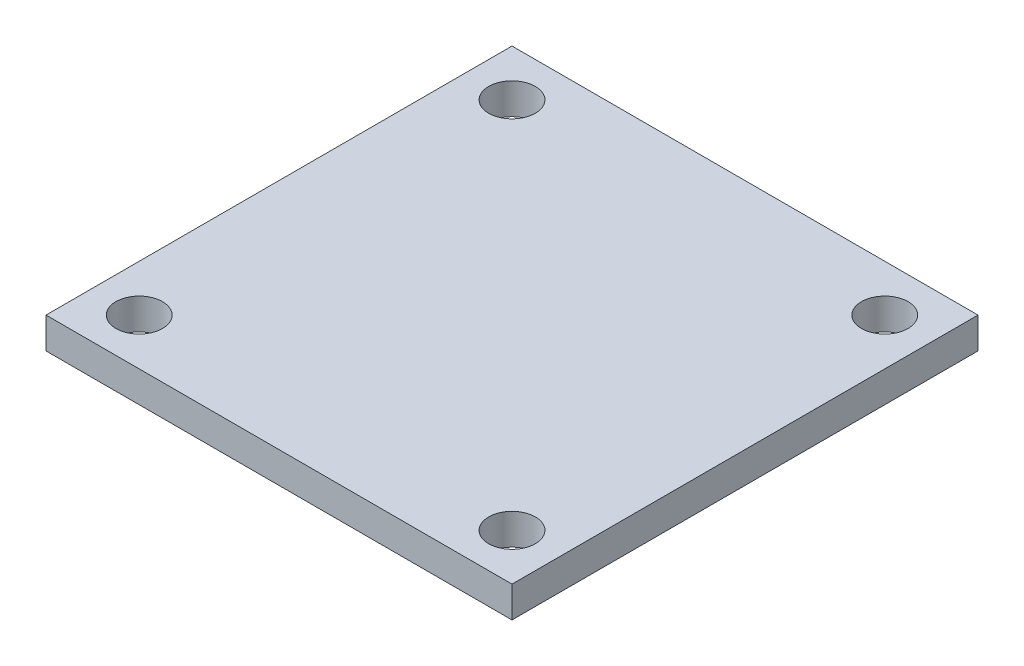
ISO-10303-21;
HEADER;
FILE_DESCRIPTION(('STEP AP214'),'2;1');
FILE_NAME('part.step','',(''),(''),'','','');
FILE_SCHEMA(('AUTOMOTIVE_DESIGN { 1 0 10303 214 1 1 1 1 }'));
ENDSEC;
DATA;
#1=APPLICATION_CONTEXT('core data for automotive mechanical design processes');
#2=APPLICATION_PROTOCOL_DEFINITION('international standard','automotive_design',2000,#1);
#3=PRODUCT_CONTEXT('',#1,'mechanical');
#4=PRODUCT('Part','Part','',(#3));
#5=PRODUCT_RELATED_PRODUCT_CATEGORY('part','',(#4));
#6=PRODUCT_DEFINITION_FORMATION('','',#4);
#7=PRODUCT_DEFINITION_CONTEXT('part definition',#1,'design');
#8=PRODUCT_DEFINITION('design','',#6,#7);
#9=PRODUCT_DEFINITION_SHAPE('','',#8);
#10=(LENGTH_UNIT() NAMED_UNIT(*) SI_UNIT(.MILLI.,.METRE.));
#11=(NAMED_UNIT(*) PLANE_ANGLE_UNIT() SI_UNIT($,.RADIAN.));
#12=(NAMED_UNIT(*) SI_UNIT($,.STERADIAN.) SOLID_ANGLE_UNIT());
#13=UNCERTAINTY_MEASURE_WITH_UNIT(LENGTH_MEASURE(1.E-05),#10,'distance_accuracy_value','');
#14=(GEOMETRIC_REPRESENTATION_CONTEXT(3) GLOBAL_UNCERTAINTY_ASSIGNED_CONTEXT((#13)) GLOBAL_UNIT_ASSIGNED_CONTEXT((#10,
#11,#12)) REPRESENTATION_CONTEXT('',''));
#15=CARTESIAN_POINT('',(0.,0.,0.));
#16=DIRECTION('',(0.,0.,1.));
#17=DIRECTION('',(1.,0.,0.));
#18=AXIS2_PLACEMENT_3D('',#15,#16,#17);
#19=CARTESIAN_POINT('',(0.,2.,0.));
#20=DIRECTION('',(0.,-1.,0.));
#21=DIRECTION('',(0.,0.,-1.));
#22=AXIS2_PLACEMENT_3D('',#19,#20,#21);
#23=PLANE('',#22);
#24=DIRECTION('',(0.,0.,-1.));
#25=VECTOR('',#24,1.);
#26=CARTESIAN_POINT('',(15.,2.,15.));
#27=LINE('',#26,#25);
#28=CARTESIAN_POINT('',(15.,2.,15.));
#29=VERTEX_POINT('',#28);
#30=CARTESIAN_POINT('',(15.,2.,-15.));
#31=VERTEX_POINT('',#30);
#32=EDGE_CURVE('E85',#29,#31,#27,.T.);
#33=ORIENTED_EDGE('',*,*,#32,.T.);
#34=DIRECTION('',(-1.,0.,0.));
#35=VECTOR('',#34,1.);
#36=CARTESIAN_POINT('',(-15.,2.,-15.));
#37=LINE('',#36,#35);
#38=CARTESIAN_POINT('',(-15.,2.,-15.));
#39=VERTEX_POINT('',#38);
#40=EDGE_CURVE('E80',#31,#39,#37,.T.);
#41=ORIENTED_EDGE('',*,*,#40,.T.);
#42=DIRECTION('',(0.,0.,1.));
#43=VECTOR('',#42,1.);
#44=CARTESIAN_POINT('',(-15.,2.,15.));
#45=LINE('',#44,#43);
#46=CARTESIAN_POINT('',(-15.,2.,15.));
#47=VERTEX_POINT('',#46);
#48=EDGE_CURVE('E83',#39,#47,#45,.T.);
#49=ORIENTED_EDGE('',*,*,#48,.T.);
#50=DIRECTION('',(1.,0.,0.));
#51=VECTOR('',#50,1.);
#52=CARTESIAN_POINT('',(-15.,2.,15.));
#53=LINE('',#52,#51);
#54=EDGE_CURVE('E50',#47,#29,#53,.T.);
#55=ORIENTED_EDGE('',*,*,#54,.T.);
#56=EDGE_LOOP('',(#33,#41,#49,#55));
#57=FACE_BOUND('',#56,.T.);
#58=CARTESIAN_POINT('',(-12.,2.,-12.));
#59=DIRECTION('',(0.,1.,0.));
#60=DIRECTION('',(0.,0.,1.));
#61=AXIS2_PLACEMENT_3D('',#58,#59,#60);
#62=CIRCLE('',#61,1.5);
#63=CARTESIAN_POINT('',(-12.,2.,-10.5));
#64=VERTEX_POINT('',#63);
#65=EDGE_CURVE('E100',#64,#64,#62,.T.);
#66=ORIENTED_EDGE('',*,*,#65,.F.);
#67=EDGE_LOOP('',(#66));
#68=FACE_BOUND('',#67,.T.);
#69=CARTESIAN_POINT('',(12.,2.,-12.));
#70=DIRECTION('',(0.,1.,0.));
#71=DIRECTION('',(0.,0.,-1.));
#72=AXIS2_PLACEMENT_3D('',#69,#70,#71);
#73=CIRCLE('',#72,1.5);
#74=CARTESIAN_POINT('',(12.,2.,-13.5));
#75=VERTEX_POINT('',#74);
#76=EDGE_CURVE('E115',#75,#75,#73,.T.);
#77=ORIENTED_EDGE('',*,*,#76,.F.);
#78=EDGE_LOOP('',(#77));
#79=FACE_BOUND('',#78,.T.);
#80=CARTESIAN_POINT('',(12.,2.,12.));
#81=DIRECTION('',(0.,1.,0.));
#82=DIRECTION('',(0.,0.,1.));
#83=AXIS2_PLACEMENT_3D('',#80,#81,#82);
#84=CIRCLE('',#83,1.5);
#85=CARTESIAN_POINT('',(12.,2.,13.5));
#86=VERTEX_POINT('',#85);
#87=EDGE_CURVE('E121',#86,#86,#84,.T.);
#88=ORIENTED_EDGE('',*,*,#87,.F.);
#89=EDGE_LOOP('',(#88));
#90=FACE_BOUND('',#89,.T.);
#91=CARTESIAN_POINT('',(-12.,2.,12.));
#92=DIRECTION('',(0.,1.,0.));
#93=DIRECTION('',(0.,0.,-1.));
#94=AXIS2_PLACEMENT_3D('',#91,#92,#93);
#95=CIRCLE('',#94,1.5);
#96=CARTESIAN_POINT('',(-12.,2.,10.5));
#97=VERTEX_POINT('',#96);
#98=EDGE_CURVE('E127',#97,#97,#95,.T.);
#99=ORIENTED_EDGE('',*,*,#98,.F.);
#100=EDGE_LOOP('',(#99));
#101=FACE_BOUND('',#100,.T.);
#102=ADVANCED_FACE('F33',(#57,#68,#79,#90,#101),#23,.F.);
#103=CARTESIAN_POINT('',(0.,0.,0.));
#104=DIRECTION('',(0.,-1.,0.));
#105=DIRECTION('',(0.,0.,-1.));
#106=AXIS2_PLACEMENT_3D('',#103,#104,#105);
#107=PLANE('',#106);
#108=CARTESIAN_POINT('',(12.,0.,12.));
#109=DIRECTION('',(0.,1.,0.));
#110=DIRECTION('',(0.,0.,1.));
#111=AXIS2_PLACEMENT_3D('',#108,#109,#110);
#112=CIRCLE('',#111,1.5);
#113=CARTESIAN_POINT('',(12.,0.,13.5));
#114=VERTEX_POINT('',#113);
#115=EDGE_CURVE('E124',#114,#114,#112,.T.);
#116=ORIENTED_EDGE('',*,*,#115,.T.);
#117=EDGE_LOOP('',(#116));
#118=FACE_BOUND('',#117,.T.);
#119=CARTESIAN_POINT('',(-12.,0.,-12.));
#120=DIRECTION('',(0.,1.,0.));
#121=DIRECTION('',(0.,0.,1.));
#122=AXIS2_PLACEMENT_3D('',#119,#120,#121);
#123=CIRCLE('',#122,1.5);
#124=CARTESIAN_POINT('',(-12.,0.,-10.5));
#125=VERTEX_POINT('',#124);
#126=EDGE_CURVE('E112',#125,#125,#123,.T.);
#127=ORIENTED_EDGE('',*,*,#126,.T.);
#128=EDGE_LOOP('',(#127));
#129=FACE_BOUND('',#128,.T.);
#130=DIRECTION('',(0.,0.,-1.));
#131=VECTOR('',#130,1.);
#132=CARTESIAN_POINT('',(15.,0.,15.));
#133=LINE('',#132,#131);
#134=CARTESIAN_POINT('',(15.,0.,15.));
#135=VERTEX_POINT('',#134);
#136=CARTESIAN_POINT('',(15.,0.,-15.));
#137=VERTEX_POINT('',#136);
#138=EDGE_CURVE('E97',#135,#137,#133,.T.);
#139=ORIENTED_EDGE('',*,*,#138,.F.);
#140=DIRECTION('',(1.,0.,0.));
#141=VECTOR('',#140,1.);
#142=CARTESIAN_POINT('',(-15.,0.,15.));
#143=LINE('',#142,#141);
#144=CARTESIAN_POINT('',(-15.,0.,15.));
#145=VERTEX_POINT('',#144);
#146=EDGE_CURVE('E73',#145,#135,#143,.T.);
#147=ORIENTED_EDGE('',*,*,#146,.F.);
#148=DIRECTION('',(0.,0.,1.));
#149=VECTOR('',#148,1.);
#150=CARTESIAN_POINT('',(-15.,0.,15.));
#151=LINE('',#150,#149);
#152=CARTESIAN_POINT('',(-15.,0.,-15.));
#153=VERTEX_POINT('',#152);
#154=EDGE_CURVE('E67',#153,#145,#151,.T.);
#155=ORIENTED_EDGE('',*,*,#154,.F.);
#156=DIRECTION('',(-1.,0.,0.));
#157=VECTOR('',#156,1.);
#158=CARTESIAN_POINT('',(-15.,0.,-15.));
#159=LINE('',#158,#157);
#160=EDGE_CURVE('E89',#137,#153,#159,.T.);
#161=ORIENTED_EDGE('',*,*,#160,.F.);
#162=EDGE_LOOP('',(#139,#147,#155,#161));
#163=FACE_BOUND('',#162,.T.);
#164=CARTESIAN_POINT('',(12.,0.,-12.));
#165=DIRECTION('',(0.,1.,0.));
#166=DIRECTION('',(0.,0.,-1.));
#167=AXIS2_PLACEMENT_3D('',#164,#165,#166);
#168=CIRCLE('',#167,1.5);
#169=CARTESIAN_POINT('',(12.,0.,-13.5));
#170=VERTEX_POINT('',#169);
#171=EDGE_CURVE('E118',#170,#170,#168,.T.);
#172=ORIENTED_EDGE('',*,*,#171,.T.);
#173=EDGE_LOOP('',(#172));
#174=FACE_BOUND('',#173,.T.);
#175=CARTESIAN_POINT('',(-12.,0.,12.));
#176=DIRECTION('',(0.,1.,0.));
#177=DIRECTION('',(0.,0.,-1.));
#178=AXIS2_PLACEMENT_3D('',#175,#176,#177);
#179=CIRCLE('',#178,1.5);
#180=CARTESIAN_POINT('',(-12.,0.,10.5));
#181=VERTEX_POINT('',#180);
#182=EDGE_CURVE('E130',#181,#181,#179,.T.);
#183=ORIENTED_EDGE('',*,*,#182,.T.);
#184=EDGE_LOOP('',(#183));
#185=FACE_BOUND('',#184,.T.);
#186=ADVANCED_FACE('F108',(#118,#129,#163,#174,#185),#107,.T.);
#187=CARTESIAN_POINT('',(15.,2.,15.));
#188=DIRECTION('',(-1.,0.,0.));
#189=DIRECTION('',(0.,0.,1.));
#190=AXIS2_PLACEMENT_3D('',#187,#188,#189);
#191=PLANE('',#190);
#192=ORIENTED_EDGE('',*,*,#138,.T.);
#193=DIRECTION('',(0.,-1.,0.));
#194=VECTOR('',#193,1.);
#195=CARTESIAN_POINT('',(15.,2.,-15.));
#196=LINE('',#195,#194);
#197=EDGE_CURVE('E11',#31,#137,#196,.T.);
#198=ORIENTED_EDGE('',*,*,#197,.F.);
#199=ORIENTED_EDGE('',*,*,#32,.F.);
#200=DIRECTION('',(0.,-1.,0.));
#201=VECTOR('',#200,1.);
#202=CARTESIAN_POINT('',(15.,2.,15.));
#203=LINE('',#202,#201);
#204=EDGE_CURVE('E93',#29,#135,#203,.T.);
#205=ORIENTED_EDGE('',*,*,#204,.T.);
#206=EDGE_LOOP('',(#192,#198,#199,#205));
#207=FACE_BOUND('',#206,.T.);
#208=ADVANCED_FACE('F35',(#207),#191,.F.);
#209=CARTESIAN_POINT('',(-15.,2.,-15.));
#210=DIRECTION('',(0.,0.,1.));
#211=DIRECTION('',(1.,0.,0.));
#212=AXIS2_PLACEMENT_3D('',#209,#210,#211);
#213=PLANE('',#212);
#214=ORIENTED_EDGE('',*,*,#160,.T.);
#215=DIRECTION('',(0.,-1.,0.));
#216=VECTOR('',#215,1.);
#217=CARTESIAN_POINT('',(-15.,2.,-15.));
#218=LINE('',#217,#216);
#219=EDGE_CURVE('E42',#39,#153,#218,.T.);
#220=ORIENTED_EDGE('',*,*,#219,.F.);
#221=ORIENTED_EDGE('',*,*,#40,.F.);
#222=ORIENTED_EDGE('',*,*,#197,.T.);
#223=EDGE_LOOP('',(#214,#220,#221,#222));
#224=FACE_BOUND('',#223,.T.);
#225=ADVANCED_FACE('F88',(#224),#213,.F.);
#226=CARTESIAN_POINT('',(-15.,2.,15.));
#227=DIRECTION('',(1.,0.,0.));
#228=DIRECTION('',(0.,0.,-1.));
#229=AXIS2_PLACEMENT_3D('',#226,#227,#228);
#230=PLANE('',#229);
#231=ORIENTED_EDGE('',*,*,#154,.T.);
#232=DIRECTION('',(0.,-1.,0.));
#233=VECTOR('',#232,1.);
#234=CARTESIAN_POINT('',(-15.,2.,15.));
#235=LINE('',#234,#233);
#236=EDGE_CURVE('E90',#47,#145,#235,.T.);
#237=ORIENTED_EDGE('',*,*,#236,.F.);
#238=ORIENTED_EDGE('',*,*,#48,.F.);
#239=ORIENTED_EDGE('',*,*,#219,.T.);
#240=EDGE_LOOP('',(#231,#237,#238,#239));
#241=FACE_BOUND('',#240,.T.);
#242=ADVANCED_FACE('F91',(#241),#230,.F.);
#243=CARTESIAN_POINT('',(-15.,2.,15.));
#244=DIRECTION('',(0.,0.,-1.));
#245=DIRECTION('',(-1.,0.,0.));
#246=AXIS2_PLACEMENT_3D('',#243,#244,#245);
#247=PLANE('',#246);
#248=ORIENTED_EDGE('',*,*,#146,.T.);
#249=ORIENTED_EDGE('',*,*,#204,.F.);
#250=ORIENTED_EDGE('',*,*,#54,.F.);
#251=ORIENTED_EDGE('',*,*,#236,.T.);
#252=EDGE_LOOP('',(#248,#249,#250,#251));
#253=FACE_BOUND('',#252,.T.);
#254=ADVANCED_FACE('F105',(#253),#247,.F.);
#255=CARTESIAN_POINT('',(-12.,2.,-12.));
#256=DIRECTION('',(0.,-1.,0.));
#257=DIRECTION('',(0.,0.,-1.));
#258=AXIS2_PLACEMENT_3D('',#255,#256,#257);
#259=CYLINDRICAL_SURFACE('',#258,1.5);
#260=ORIENTED_EDGE('',*,*,#65,.T.);
#261=EDGE_LOOP('',(#260));
#262=FACE_BOUND('',#261,.T.);
#263=ORIENTED_EDGE('',*,*,#126,.F.);
#264=EDGE_LOOP('',(#263));
#265=FACE_BOUND('',#264,.T.);
#266=ADVANCED_FACE('F147',(#262,#265),#259,.F.);
#267=CARTESIAN_POINT('',(12.,2.,-12.));
#268=DIRECTION('',(0.,-1.,0.));
#269=DIRECTION('',(0.,0.,-1.));
#270=AXIS2_PLACEMENT_3D('',#267,#268,#269);
#271=CYLINDRICAL_SURFACE('',#270,1.5);
#272=ORIENTED_EDGE('',*,*,#76,.T.);
#273=EDGE_LOOP('',(#272));
#274=FACE_BOUND('',#273,.T.);
#275=ORIENTED_EDGE('',*,*,#171,.F.);
#276=EDGE_LOOP('',(#275));
#277=FACE_BOUND('',#276,.T.);
#278=ADVANCED_FACE('F193',(#274,#277),#271,.F.);
#279=CARTESIAN_POINT('',(12.,2.,12.));
#280=DIRECTION('',(0.,-1.,0.));
#281=DIRECTION('',(0.,0.,-1.));
#282=AXIS2_PLACEMENT_3D('',#279,#280,#281);
#283=CYLINDRICAL_SURFACE('',#282,1.5);
#284=ORIENTED_EDGE('',*,*,#87,.T.);
#285=EDGE_LOOP('',(#284));
#286=FACE_BOUND('',#285,.T.);
#287=ORIENTED_EDGE('',*,*,#115,.F.);
#288=EDGE_LOOP('',(#287));
#289=FACE_BOUND('',#288,.T.);
#290=ADVANCED_FACE('F201',(#286,#289),#283,.F.);
#291=CARTESIAN_POINT('',(-12.,2.,12.));
#292=DIRECTION('',(0.,-1.,0.));
#293=DIRECTION('',(0.,0.,-1.));
#294=AXIS2_PLACEMENT_3D('',#291,#292,#293);
#295=CYLINDRICAL_SURFACE('',#294,1.5);
#296=ORIENTED_EDGE('',*,*,#98,.T.);
#297=EDGE_LOOP('',(#296));
#298=FACE_BOUND('',#297,.T.);
#299=ORIENTED_EDGE('',*,*,#182,.F.);
#300=EDGE_LOOP('',(#299));
#301=FACE_BOUND('',#300,.T.);
#302=ADVANCED_FACE('F136',(#298,#301),#295,.F.);
#303=CLOSED_SHELL('',(#102,#186,#208,#225,#242,#254,#266,#278,#290,#302));
#304=MANIFOLD_SOLID_BREP('B2',#303);
#305=ADVANCED_BREP_SHAPE_REPRESENTATION('',(#18,#304),#14);
#306=SHAPE_DEFINITION_REPRESENTATION(#9,#305);
ENDSEC;
END-ISO-10303-21;
